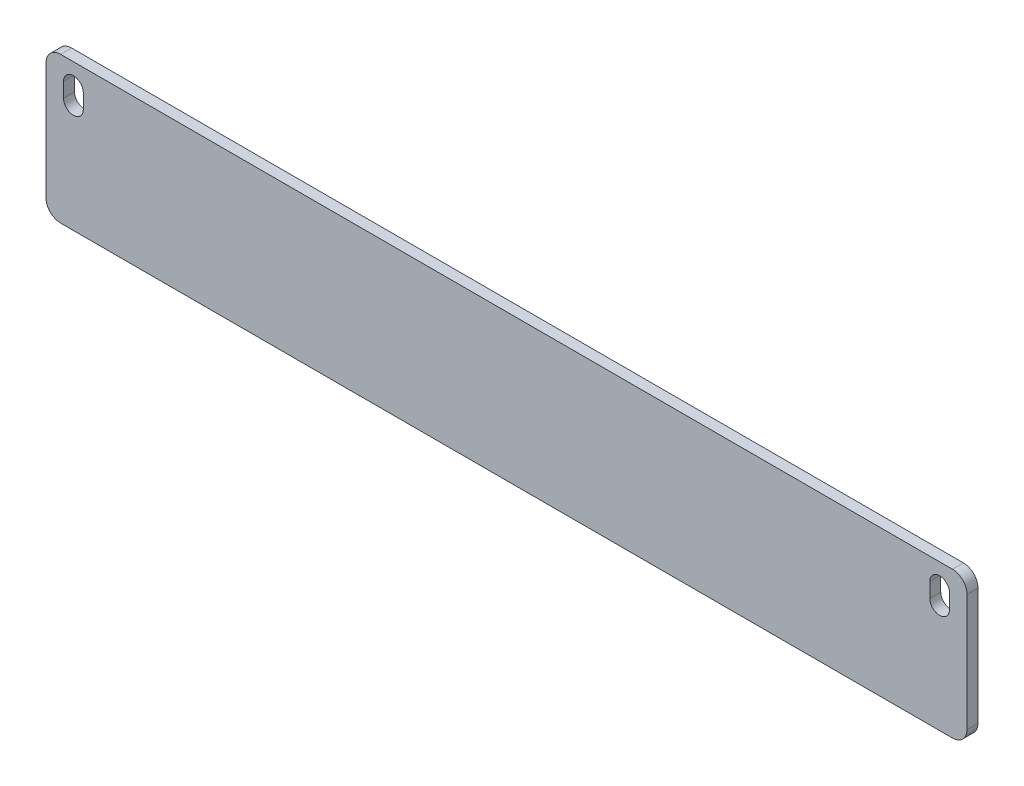
ISO-10303-21;
HEADER;
FILE_DESCRIPTION(('STEP AP214'),'2;1');
FILE_NAME('part.step','',(''),(''),'','','');
FILE_SCHEMA(('AUTOMOTIVE_DESIGN { 1 0 10303 214 1 1 1 1 }'));
ENDSEC;
DATA;
#1=APPLICATION_CONTEXT('core data for automotive mechanical design processes');
#2=APPLICATION_PROTOCOL_DEFINITION('international standard','automotive_design',2000,#1);
#3=PRODUCT_CONTEXT('',#1,'mechanical');
#4=PRODUCT('Part','Part','',(#3));
#5=PRODUCT_RELATED_PRODUCT_CATEGORY('part','',(#4));
#6=PRODUCT_DEFINITION_FORMATION('','',#4);
#7=PRODUCT_DEFINITION_CONTEXT('part definition',#1,'design');
#8=PRODUCT_DEFINITION('design','',#6,#7);
#9=PRODUCT_DEFINITION_SHAPE('','',#8);
#10=(LENGTH_UNIT() NAMED_UNIT(*) SI_UNIT(.MILLI.,.METRE.));
#11=(NAMED_UNIT(*) PLANE_ANGLE_UNIT() SI_UNIT($,.RADIAN.));
#12=(NAMED_UNIT(*) SI_UNIT($,.STERADIAN.) SOLID_ANGLE_UNIT());
#13=UNCERTAINTY_MEASURE_WITH_UNIT(LENGTH_MEASURE(1.E-05),#10,'distance_accuracy_value','');
#14=(GEOMETRIC_REPRESENTATION_CONTEXT(3) GLOBAL_UNCERTAINTY_ASSIGNED_CONTEXT((#13)) GLOBAL_UNIT_ASSIGNED_CONTEXT((#10,
#11,#12)) REPRESENTATION_CONTEXT('',''));
#15=CARTESIAN_POINT('',(0.,0.,0.));
#16=DIRECTION('',(0.,0.,1.));
#17=DIRECTION('',(1.,0.,0.));
#18=AXIS2_PLACEMENT_3D('',#15,#16,#17);
#19=CARTESIAN_POINT('',(0.,0.,3.));
#20=DIRECTION('',(0.,0.,-1.));
#21=DIRECTION('',(-1.,0.,0.));
#22=AXIS2_PLACEMENT_3D('',#19,#20,#21);
#23=PLANE('',#22);
#24=CARTESIAN_POINT('',(7.5,34.,3.));
#25=DIRECTION('',(0.,0.,1.));
#26=DIRECTION('',(1.,0.,0.));
#27=AXIS2_PLACEMENT_3D('',#24,#25,#26);
#28=CIRCLE('',#27,2.7);
#29=CARTESIAN_POINT('',(10.2,34.,3.));
#30=VERTEX_POINT('',#29);
#31=CARTESIAN_POINT('',(4.8,34.,3.));
#32=VERTEX_POINT('',#31);
#33=EDGE_CURVE('E261',#30,#32,#28,.T.);
#34=ORIENTED_EDGE('',*,*,#33,.F.);
#35=DIRECTION('',(0.,1.,0.));
#36=VECTOR('',#35,1.);
#37=CARTESIAN_POINT('',(10.2,34.,3.));
#38=LINE('',#37,#36);
#39=CARTESIAN_POINT('',(10.2,30.,3.));
#40=VERTEX_POINT('',#39);
#41=EDGE_CURVE('E269',#40,#30,#38,.T.);
#42=ORIENTED_EDGE('',*,*,#41,.F.);
#43=CARTESIAN_POINT('',(7.5,30.,3.));
#44=DIRECTION('',(0.,0.,1.));
#45=DIRECTION('',(1.,0.,0.));
#46=AXIS2_PLACEMENT_3D('',#43,#44,#45);
#47=CIRCLE('',#46,2.7);
#48=CARTESIAN_POINT('',(4.8,30.,3.));
#49=VERTEX_POINT('',#48);
#50=EDGE_CURVE('E266',#49,#40,#47,.T.);
#51=ORIENTED_EDGE('',*,*,#50,.F.);
#52=DIRECTION('',(0.,-1.,0.));
#53=VECTOR('',#52,1.);
#54=CARTESIAN_POINT('',(4.8,34.,3.));
#55=LINE('',#54,#53);
#56=EDGE_CURVE('E263',#32,#49,#55,.T.);
#57=ORIENTED_EDGE('',*,*,#56,.F.);
#58=EDGE_LOOP('',(#34,#42,#51,#57));
#59=FACE_BOUND('',#58,.T.);
#60=DIRECTION('',(0.,1.,0.));
#61=VECTOR('',#60,1.);
#62=CARTESIAN_POINT('',(252.,0.,3.));
#63=LINE('',#62,#61);
#64=CARTESIAN_POINT('',(252.,4.,3.));
#65=VERTEX_POINT('',#64);
#66=CARTESIAN_POINT('',(252.,36.,3.));
#67=VERTEX_POINT('',#66);
#68=EDGE_CURVE('E299',#65,#67,#63,.T.);
#69=ORIENTED_EDGE('',*,*,#68,.T.);
#70=CARTESIAN_POINT('',(248.,36.,3.));
#71=DIRECTION('',(0.,0.,-1.));
#72=DIRECTION('',(-1.,0.,0.));
#73=AXIS2_PLACEMENT_3D('',#70,#71,#72);
#74=CIRCLE('',#73,4.);
#75=CARTESIAN_POINT('',(248.,40.,3.));
#76=VERTEX_POINT('',#75);
#77=EDGE_CURVE('E341',#67,#76,#74,.F.);
#78=ORIENTED_EDGE('',*,*,#77,.T.);
#79=DIRECTION('',(-1.,0.,0.));
#80=VECTOR('',#79,1.);
#81=CARTESIAN_POINT('',(0.,40.,3.));
#82=LINE('',#81,#80);
#83=CARTESIAN_POINT('',(4.,40.,3.));
#84=VERTEX_POINT('',#83);
#85=EDGE_CURVE('E302',#76,#84,#82,.T.);
#86=ORIENTED_EDGE('',*,*,#85,.T.);
#87=CARTESIAN_POINT('',(4.,36.,3.));
#88=DIRECTION('',(0.,0.,-1.));
#89=DIRECTION('',(-1.,0.,0.));
#90=AXIS2_PLACEMENT_3D('',#87,#88,#89);
#91=CIRCLE('',#90,4.);
#92=CARTESIAN_POINT('',(0.,36.,3.));
#93=VERTEX_POINT('',#92);
#94=EDGE_CURVE('E335',#84,#93,#91,.F.);
#95=ORIENTED_EDGE('',*,*,#94,.T.);
#96=DIRECTION('',(0.,-1.,0.));
#97=VECTOR('',#96,1.);
#98=CARTESIAN_POINT('',(0.,0.,3.));
#99=LINE('',#98,#97);
#100=CARTESIAN_POINT('',(0.,4.,3.));
#101=VERTEX_POINT('',#100);
#102=EDGE_CURVE('E292',#93,#101,#99,.T.);
#103=ORIENTED_EDGE('',*,*,#102,.T.);
#104=CARTESIAN_POINT('',(4.,4.,3.));
#105=DIRECTION('',(0.,0.,-1.));
#106=DIRECTION('',(-1.,0.,0.));
#107=AXIS2_PLACEMENT_3D('',#104,#105,#106);
#108=CIRCLE('',#107,4.);
#109=CARTESIAN_POINT('',(4.,0.,3.));
#110=VERTEX_POINT('',#109);
#111=EDGE_CURVE('E337',#101,#110,#108,.F.);
#112=ORIENTED_EDGE('',*,*,#111,.T.);
#113=DIRECTION('',(1.,0.,0.));
#114=VECTOR('',#113,1.);
#115=CARTESIAN_POINT('',(0.,0.,3.));
#116=LINE('',#115,#114);
#117=CARTESIAN_POINT('',(248.,0.,3.));
#118=VERTEX_POINT('',#117);
#119=EDGE_CURVE('E295',#110,#118,#116,.T.);
#120=ORIENTED_EDGE('',*,*,#119,.T.);
#121=CARTESIAN_POINT('',(248.,4.,3.));
#122=DIRECTION('',(0.,0.,-1.));
#123=DIRECTION('',(-1.,0.,0.));
#124=AXIS2_PLACEMENT_3D('',#121,#122,#123);
#125=CIRCLE('',#124,4.);
#126=EDGE_CURVE('E339',#118,#65,#125,.F.);
#127=ORIENTED_EDGE('',*,*,#126,.T.);
#128=EDGE_LOOP('',(#69,#78,#86,#95,#103,#112,#120,#127));
#129=FACE_BOUND('',#128,.T.);
#130=CARTESIAN_POINT('',(244.5,34.,3.));
#131=DIRECTION('',(0.,0.,1.));
#132=DIRECTION('',(1.,0.,0.));
#133=AXIS2_PLACEMENT_3D('',#130,#131,#132);
#134=CIRCLE('',#133,2.70000000000004);
#135=CARTESIAN_POINT('',(247.2,34.,3.));
#136=VERTEX_POINT('',#135);
#137=CARTESIAN_POINT('',(241.8,34.,3.));
#138=VERTEX_POINT('',#137);
#139=EDGE_CURVE('E218',#136,#138,#134,.T.);
#140=ORIENTED_EDGE('',*,*,#139,.F.);
#141=DIRECTION('',(0.,1.,0.));
#142=VECTOR('',#141,1.);
#143=CARTESIAN_POINT('',(247.2,34.,3.));
#144=LINE('',#143,#142);
#145=CARTESIAN_POINT('',(247.2,30.,3.));
#146=VERTEX_POINT('',#145);
#147=EDGE_CURVE('E243',#146,#136,#144,.T.);
#148=ORIENTED_EDGE('',*,*,#147,.F.);
#149=CARTESIAN_POINT('',(244.5,30.,3.));
#150=DIRECTION('',(0.,0.,1.));
#151=DIRECTION('',(1.,0.,0.));
#152=AXIS2_PLACEMENT_3D('',#149,#150,#151);
#153=CIRCLE('',#152,2.69999999999998);
#154=CARTESIAN_POINT('',(241.8,30.,3.));
#155=VERTEX_POINT('',#154);
#156=EDGE_CURVE('E241',#155,#146,#153,.T.);
#157=ORIENTED_EDGE('',*,*,#156,.F.);
#158=DIRECTION('',(0.,-1.,0.));
#159=VECTOR('',#158,1.);
#160=CARTESIAN_POINT('',(241.8,34.,3.));
#161=LINE('',#160,#159);
#162=EDGE_CURVE('E228',#138,#155,#161,.T.);
#163=ORIENTED_EDGE('',*,*,#162,.F.);
#164=EDGE_LOOP('',(#140,#148,#157,#163));
#165=FACE_BOUND('',#164,.T.);
#166=ADVANCED_FACE('F38',(#59,#129,#165),#23,.F.);
#167=CARTESIAN_POINT('',(0.,0.,0.));
#168=DIRECTION('',(0.,0.,-1.));
#169=DIRECTION('',(-1.,0.,0.));
#170=AXIS2_PLACEMENT_3D('',#167,#168,#169);
#171=PLANE('',#170);
#172=CARTESIAN_POINT('',(17.,4.,0.));
#173=DIRECTION('',(0.,0.,-1.));
#174=DIRECTION('',(-1.,0.,0.));
#175=AXIS2_PLACEMENT_3D('',#172,#173,#174);
#176=CIRCLE('',#175,2.);
#177=CARTESIAN_POINT('',(15.,4.,0.));
#178=VERTEX_POINT('',#177);
#179=CARTESIAN_POINT('',(17.,6.,0.));
#180=VERTEX_POINT('',#179);
#181=EDGE_CURVE('E353',#178,#180,#176,.T.);
#182=ORIENTED_EDGE('',*,*,#181,.F.);
#183=DIRECTION('',(0.,-1.,0.));
#184=VECTOR('',#183,1.);
#185=CARTESIAN_POINT('',(15.,0.,0.));
#186=LINE('',#185,#184);
#187=CARTESIAN_POINT('',(15.,0.,0.));
#188=VERTEX_POINT('',#187);
#189=EDGE_CURVE('E363',#178,#188,#186,.T.);
#190=ORIENTED_EDGE('',*,*,#189,.T.);
#191=DIRECTION('',(1.,0.,0.));
#192=VECTOR('',#191,1.);
#193=CARTESIAN_POINT('',(0.,0.,0.));
#194=LINE('',#193,#192);
#195=CARTESIAN_POINT('',(4.,0.,0.));
#196=VERTEX_POINT('',#195);
#197=EDGE_CURVE('E309',#196,#188,#194,.T.);
#198=ORIENTED_EDGE('',*,*,#197,.F.);
#199=CARTESIAN_POINT('',(4.,4.,0.));
#200=DIRECTION('',(0.,0.,-1.));
#201=DIRECTION('',(-1.,0.,0.));
#202=AXIS2_PLACEMENT_3D('',#199,#200,#201);
#203=CIRCLE('',#202,4.);
#204=CARTESIAN_POINT('',(0.,4.,0.));
#205=VERTEX_POINT('',#204);
#206=EDGE_CURVE('E323',#196,#205,#203,.T.);
#207=ORIENTED_EDGE('',*,*,#206,.T.);
#208=DIRECTION('',(0.,-1.,0.));
#209=VECTOR('',#208,1.);
#210=CARTESIAN_POINT('',(0.,0.,0.));
#211=LINE('',#210,#209);
#212=CARTESIAN_POINT('',(0.,36.,0.));
#213=VERTEX_POINT('',#212);
#214=EDGE_CURVE('E291',#213,#205,#211,.T.);
#215=ORIENTED_EDGE('',*,*,#214,.F.);
#216=CARTESIAN_POINT('',(4.,36.,0.));
#217=DIRECTION('',(0.,0.,-1.));
#218=DIRECTION('',(-1.,0.,0.));
#219=AXIS2_PLACEMENT_3D('',#216,#217,#218);
#220=CIRCLE('',#219,4.);
#221=CARTESIAN_POINT('',(4.,40.,0.));
#222=VERTEX_POINT('',#221);
#223=EDGE_CURVE('E321',#213,#222,#220,.T.);
#224=ORIENTED_EDGE('',*,*,#223,.T.);
#225=DIRECTION('',(-1.,0.,0.));
#226=VECTOR('',#225,1.);
#227=CARTESIAN_POINT('',(0.,40.,0.));
#228=LINE('',#227,#226);
#229=CARTESIAN_POINT('',(248.,40.,0.));
#230=VERTEX_POINT('',#229);
#231=EDGE_CURVE('E296',#230,#222,#228,.T.);
#232=ORIENTED_EDGE('',*,*,#231,.F.);
#233=CARTESIAN_POINT('',(248.,36.,0.));
#234=DIRECTION('',(0.,0.,-1.));
#235=DIRECTION('',(-1.,0.,0.));
#236=AXIS2_PLACEMENT_3D('',#233,#234,#235);
#237=CIRCLE('',#236,4.);
#238=CARTESIAN_POINT('',(252.,36.,0.));
#239=VERTEX_POINT('',#238);
#240=EDGE_CURVE('E328',#230,#239,#237,.T.);
#241=ORIENTED_EDGE('',*,*,#240,.T.);
#242=DIRECTION('',(0.,1.,0.));
#243=VECTOR('',#242,1.);
#244=CARTESIAN_POINT('',(252.,0.,0.));
#245=LINE('',#244,#243);
#246=CARTESIAN_POINT('',(252.,4.,0.));
#247=VERTEX_POINT('',#246);
#248=EDGE_CURVE('E312',#247,#239,#245,.T.);
#249=ORIENTED_EDGE('',*,*,#248,.F.);
#250=CARTESIAN_POINT('',(248.,4.,0.));
#251=DIRECTION('',(0.,0.,-1.));
#252=DIRECTION('',(-1.,0.,0.));
#253=AXIS2_PLACEMENT_3D('',#250,#251,#252);
#254=CIRCLE('',#253,4.);
#255=CARTESIAN_POINT('',(248.,0.,0.));
#256=VERTEX_POINT('',#255);
#257=EDGE_CURVE('E325',#247,#256,#254,.T.);
#258=ORIENTED_EDGE('',*,*,#257,.T.);
#259=CARTESIAN_POINT('',(237.,0.,0.));
#260=VERTEX_POINT('',#259);
#261=EDGE_CURVE('E308',#260,#256,#194,.T.);
#262=ORIENTED_EDGE('',*,*,#261,.F.);
#263=DIRECTION('',(0.,-1.,0.));
#264=VECTOR('',#263,1.);
#265=CARTESIAN_POINT('',(237.,5.,0.));
#266=LINE('',#265,#264);
#267=CARTESIAN_POINT('',(237.,4.,0.));
#268=VERTEX_POINT('',#267);
#269=EDGE_CURVE('E361',#260,#268,#266,.F.);
#270=ORIENTED_EDGE('',*,*,#269,.T.);
#271=CARTESIAN_POINT('',(235.,4.,0.));
#272=DIRECTION('',(0.,0.,-1.));
#273=DIRECTION('',(-1.,0.,0.));
#274=AXIS2_PLACEMENT_3D('',#271,#272,#273);
#275=CIRCLE('',#274,2.);
#276=CARTESIAN_POINT('',(235.,6.,0.));
#277=VERTEX_POINT('',#276);
#278=EDGE_CURVE('E358',#277,#268,#275,.T.);
#279=ORIENTED_EDGE('',*,*,#278,.F.);
#280=DIRECTION('',(-1.,0.,0.));
#281=VECTOR('',#280,1.);
#282=CARTESIAN_POINT('',(0.,6.,0.));
#283=LINE('',#282,#281);
#284=EDGE_CURVE('E356',#277,#180,#283,.T.);
#285=ORIENTED_EDGE('',*,*,#284,.T.);
#286=EDGE_LOOP('',(#182,#190,#198,#207,#215,#224,#232,#241,#249,#258,#262,#270,#279,#285));
#287=FACE_BOUND('',#286,.T.);
#288=DIRECTION('',(0.,1.,0.));
#289=VECTOR('',#288,1.);
#290=CARTESIAN_POINT('',(10.2,34.,0.));
#291=LINE('',#290,#289);
#292=CARTESIAN_POINT('',(10.2,30.,0.));
#293=VERTEX_POINT('',#292);
#294=CARTESIAN_POINT('',(10.2,34.,0.));
#295=VERTEX_POINT('',#294);
#296=EDGE_CURVE('E264',#293,#295,#291,.T.);
#297=ORIENTED_EDGE('',*,*,#296,.T.);
#298=CARTESIAN_POINT('',(7.5,34.,0.));
#299=DIRECTION('',(0.,0.,1.));
#300=DIRECTION('',(1.,0.,0.));
#301=AXIS2_PLACEMENT_3D('',#298,#299,#300);
#302=CIRCLE('',#301,2.7);
#303=CARTESIAN_POINT('',(4.8,34.,0.));
#304=VERTEX_POINT('',#303);
#305=EDGE_CURVE('E236',#295,#304,#302,.T.);
#306=ORIENTED_EDGE('',*,*,#305,.T.);
#307=DIRECTION('',(0.,-1.,0.));
#308=VECTOR('',#307,1.);
#309=CARTESIAN_POINT('',(4.8,34.,0.));
#310=LINE('',#309,#308);
#311=CARTESIAN_POINT('',(4.8,30.,0.));
#312=VERTEX_POINT('',#311);
#313=EDGE_CURVE('E274',#304,#312,#310,.T.);
#314=ORIENTED_EDGE('',*,*,#313,.T.);
#315=CARTESIAN_POINT('',(7.5,30.,0.));
#316=DIRECTION('',(0.,0.,1.));
#317=DIRECTION('',(1.,0.,0.));
#318=AXIS2_PLACEMENT_3D('',#315,#316,#317);
#319=CIRCLE('',#318,2.7);
#320=EDGE_CURVE('E277',#312,#293,#319,.T.);
#321=ORIENTED_EDGE('',*,*,#320,.T.);
#322=EDGE_LOOP('',(#297,#306,#314,#321));
#323=FACE_BOUND('',#322,.T.);
#324=DIRECTION('',(0.,1.,0.));
#325=VECTOR('',#324,1.);
#326=CARTESIAN_POINT('',(247.2,34.,0.));
#327=LINE('',#326,#325);
#328=CARTESIAN_POINT('',(247.2,30.,0.));
#329=VERTEX_POINT('',#328);
#330=CARTESIAN_POINT('',(247.2,34.,0.));
#331=VERTEX_POINT('',#330);
#332=EDGE_CURVE('E229',#329,#331,#327,.T.);
#333=ORIENTED_EDGE('',*,*,#332,.T.);
#334=CARTESIAN_POINT('',(244.5,34.,0.));
#335=DIRECTION('',(0.,0.,1.));
#336=DIRECTION('',(1.,0.,0.));
#337=AXIS2_PLACEMENT_3D('',#334,#335,#336);
#338=CIRCLE('',#337,2.70000000000004);
#339=CARTESIAN_POINT('',(241.8,34.,0.));
#340=VERTEX_POINT('',#339);
#341=EDGE_CURVE('E248',#331,#340,#338,.T.);
#342=ORIENTED_EDGE('',*,*,#341,.T.);
#343=DIRECTION('',(0.,-1.,0.));
#344=VECTOR('',#343,1.);
#345=CARTESIAN_POINT('',(241.8,34.,0.));
#346=LINE('',#345,#344);
#347=CARTESIAN_POINT('',(241.8,30.,0.));
#348=VERTEX_POINT('',#347);
#349=EDGE_CURVE('E235',#340,#348,#346,.T.);
#350=ORIENTED_EDGE('',*,*,#349,.T.);
#351=CARTESIAN_POINT('',(244.5,30.,0.));
#352=DIRECTION('',(0.,0.,1.));
#353=DIRECTION('',(1.,0.,0.));
#354=AXIS2_PLACEMENT_3D('',#351,#352,#353);
#355=CIRCLE('',#354,2.69999999999998);
#356=EDGE_CURVE('E252',#348,#329,#355,.T.);
#357=ORIENTED_EDGE('',*,*,#356,.T.);
#358=EDGE_LOOP('',(#333,#342,#350,#357));
#359=FACE_BOUND('',#358,.T.);
#360=ADVANCED_FACE('F457',(#287,#323,#359),#171,.T.);
#361=CARTESIAN_POINT('',(0.,0.,3.));
#362=DIRECTION('',(1.,0.,0.));
#363=DIRECTION('',(0.,0.,-1.));
#364=AXIS2_PLACEMENT_3D('',#361,#362,#363);
#365=PLANE('',#364);
#366=ORIENTED_EDGE('',*,*,#214,.T.);
#367=DIRECTION('',(0.,0.,-1.));
#368=VECTOR('',#367,1.);
#369=CARTESIAN_POINT('',(0.,4.,3.));
#370=LINE('',#369,#368);
#371=EDGE_CURVE('E351',#205,#101,#370,.F.);
#372=ORIENTED_EDGE('',*,*,#371,.T.);
#373=ORIENTED_EDGE('',*,*,#102,.F.);
#374=DIRECTION('',(0.,0.,-1.));
#375=VECTOR('',#374,1.);
#376=CARTESIAN_POINT('',(0.,36.,3.));
#377=LINE('',#376,#375);
#378=EDGE_CURVE('E348',#93,#213,#377,.T.);
#379=ORIENTED_EDGE('',*,*,#378,.T.);
#380=EDGE_LOOP('',(#366,#372,#373,#379));
#381=FACE_BOUND('',#380,.T.);
#382=ADVANCED_FACE('F490',(#381),#365,.F.);
#383=CARTESIAN_POINT('',(0.,0.,3.));
#384=DIRECTION('',(0.,1.,0.));
#385=DIRECTION('',(0.,0.,1.));
#386=AXIS2_PLACEMENT_3D('',#383,#384,#385);
#387=PLANE('',#386);
#388=DIRECTION('',(1.,0.,0.));
#389=VECTOR('',#388,1.);
#390=CARTESIAN_POINT('',(16.,0.,-8.));
#391=LINE('',#390,#389);
#392=CARTESIAN_POINT('',(17.,0.,-8.));
#393=VERTEX_POINT('',#392);
#394=CARTESIAN_POINT('',(235.,0.,-8.));
#395=VERTEX_POINT('',#394);
#396=EDGE_CURVE('E435',#393,#395,#391,.T.);
#397=ORIENTED_EDGE('',*,*,#396,.T.);
#398=CARTESIAN_POINT('',(235.,0.,-7.));
#399=DIRECTION('',(0.,1.,0.));
#400=DIRECTION('',(0.,0.,1.));
#401=AXIS2_PLACEMENT_3D('',#398,#399,#400);
#402=CIRCLE('',#401,1.);
#403=CARTESIAN_POINT('',(236.,0.,-7.));
#404=VERTEX_POINT('',#403);
#405=EDGE_CURVE('E393',#395,#404,#402,.F.);
#406=ORIENTED_EDGE('',*,*,#405,.T.);
#407=DIRECTION('',(0.,0.,1.));
#408=VECTOR('',#407,1.);
#409=CARTESIAN_POINT('',(236.,0.,-8.));
#410=LINE('',#409,#408);
#411=CARTESIAN_POINT('',(236.,0.,-1.));
#412=VERTEX_POINT('',#411);
#413=EDGE_CURVE('E250',#404,#412,#410,.T.);
#414=ORIENTED_EDGE('',*,*,#413,.T.);
#415=CARTESIAN_POINT('',(237.,0.,-1.));
#416=DIRECTION('',(0.,1.,0.));
#417=DIRECTION('',(0.,0.,1.));
#418=AXIS2_PLACEMENT_3D('',#415,#416,#417);
#419=CIRCLE('',#418,1.);
#420=EDGE_CURVE('E11',#412,#260,#419,.T.);
#421=ORIENTED_EDGE('',*,*,#420,.T.);
#422=ORIENTED_EDGE('',*,*,#261,.T.);
#423=DIRECTION('',(0.,0.,-1.));
#424=VECTOR('',#423,1.);
#425=CARTESIAN_POINT('',(248.,0.,3.));
#426=LINE('',#425,#424);
#427=EDGE_CURVE('E346',#256,#118,#426,.F.);
#428=ORIENTED_EDGE('',*,*,#427,.T.);
#429=ORIENTED_EDGE('',*,*,#119,.F.);
#430=DIRECTION('',(0.,0.,-1.));
#431=VECTOR('',#430,1.);
#432=CARTESIAN_POINT('',(4.,0.,3.));
#433=LINE('',#432,#431);
#434=EDGE_CURVE('E343',#110,#196,#433,.T.);
#435=ORIENTED_EDGE('',*,*,#434,.T.);
#436=ORIENTED_EDGE('',*,*,#197,.T.);
#437=CARTESIAN_POINT('',(15.,0.,-1.));
#438=DIRECTION('',(0.,1.,0.));
#439=DIRECTION('',(0.,0.,1.));
#440=AXIS2_PLACEMENT_3D('',#437,#438,#439);
#441=CIRCLE('',#440,1.);
#442=CARTESIAN_POINT('',(16.,0.,-1.));
#443=VERTEX_POINT('',#442);
#444=EDGE_CURVE('E47',#188,#443,#441,.T.);
#445=ORIENTED_EDGE('',*,*,#444,.T.);
#446=DIRECTION('',(0.,0.,-1.));
#447=VECTOR('',#446,1.);
#448=CARTESIAN_POINT('',(16.,0.,0.));
#449=LINE('',#448,#447);
#450=CARTESIAN_POINT('',(16.,0.,-7.));
#451=VERTEX_POINT('',#450);
#452=EDGE_CURVE('E430',#443,#451,#449,.T.);
#453=ORIENTED_EDGE('',*,*,#452,.T.);
#454=CARTESIAN_POINT('',(17.,0.,-7.));
#455=DIRECTION('',(0.,1.,0.));
#456=DIRECTION('',(0.,0.,1.));
#457=AXIS2_PLACEMENT_3D('',#454,#455,#456);
#458=CIRCLE('',#457,1.);
#459=EDGE_CURVE('E391',#451,#393,#458,.F.);
#460=ORIENTED_EDGE('',*,*,#459,.T.);
#461=EDGE_LOOP('',(#397,#406,#414,#421,#422,#428,#429,#435,#436,#445,#453,#460));
#462=FACE_BOUND('',#461,.T.);
#463=ADVANCED_FACE('F445',(#462),#387,.F.);
#464=CARTESIAN_POINT('',(252.,0.,3.));
#465=DIRECTION('',(-1.,0.,0.));
#466=DIRECTION('',(0.,0.,1.));
#467=AXIS2_PLACEMENT_3D('',#464,#465,#466);
#468=PLANE('',#467);
#469=ORIENTED_EDGE('',*,*,#248,.T.);
#470=DIRECTION('',(0.,0.,-1.));
#471=VECTOR('',#470,1.);
#472=CARTESIAN_POINT('',(252.,36.,3.));
#473=LINE('',#472,#471);
#474=EDGE_CURVE('E333',#239,#67,#473,.F.);
#475=ORIENTED_EDGE('',*,*,#474,.T.);
#476=ORIENTED_EDGE('',*,*,#68,.F.);
#477=DIRECTION('',(0.,0.,-1.));
#478=VECTOR('',#477,1.);
#479=CARTESIAN_POINT('',(252.,4.,3.));
#480=LINE('',#479,#478);
#481=EDGE_CURVE('E330',#65,#247,#480,.T.);
#482=ORIENTED_EDGE('',*,*,#481,.T.);
#483=EDGE_LOOP('',(#469,#475,#476,#482));
#484=FACE_BOUND('',#483,.T.);
#485=ADVANCED_FACE('F472',(#484),#468,.F.);
#486=CARTESIAN_POINT('',(0.,40.,3.));
#487=DIRECTION('',(0.,-1.,0.));
#488=DIRECTION('',(0.,0.,-1.));
#489=AXIS2_PLACEMENT_3D('',#486,#487,#488);
#490=PLANE('',#489);
#491=ORIENTED_EDGE('',*,*,#85,.F.);
#492=DIRECTION('',(0.,0.,-1.));
#493=VECTOR('',#492,1.);
#494=CARTESIAN_POINT('',(248.,40.,3.));
#495=LINE('',#494,#493);
#496=EDGE_CURVE('E318',#76,#230,#495,.T.);
#497=ORIENTED_EDGE('',*,*,#496,.T.);
#498=ORIENTED_EDGE('',*,*,#231,.T.);
#499=DIRECTION('',(0.,0.,-1.));
#500=VECTOR('',#499,1.);
#501=CARTESIAN_POINT('',(4.,40.,3.));
#502=LINE('',#501,#500);
#503=EDGE_CURVE('E305',#222,#84,#502,.F.);
#504=ORIENTED_EDGE('',*,*,#503,.T.);
#505=EDGE_LOOP('',(#491,#497,#498,#504));
#506=FACE_BOUND('',#505,.T.);
#507=ADVANCED_FACE('F481',(#506),#490,.F.);
#508=CARTESIAN_POINT('',(7.5,34.,3.));
#509=DIRECTION('',(0.,0.,-1.));
#510=DIRECTION('',(-1.,0.,0.));
#511=AXIS2_PLACEMENT_3D('',#508,#509,#510);
#512=CYLINDRICAL_SURFACE('',#511,2.7);
#513=ORIENTED_EDGE('',*,*,#305,.F.);
#514=DIRECTION('',(0.,0.,-1.));
#515=VECTOR('',#514,1.);
#516=CARTESIAN_POINT('',(10.2,34.,3.));
#517=LINE('',#516,#515);
#518=EDGE_CURVE('E271',#30,#295,#517,.T.);
#519=ORIENTED_EDGE('',*,*,#518,.F.);
#520=ORIENTED_EDGE('',*,*,#33,.T.);
#521=DIRECTION('',(0.,0.,-1.));
#522=VECTOR('',#521,1.);
#523=CARTESIAN_POINT('',(4.8,34.,3.));
#524=LINE('',#523,#522);
#525=EDGE_CURVE('E288',#32,#304,#524,.T.);
#526=ORIENTED_EDGE('',*,*,#525,.T.);
#527=EDGE_LOOP('',(#513,#519,#520,#526));
#528=FACE_BOUND('',#527,.T.);
#529=ADVANCED_FACE('F553',(#528),#512,.F.);
#530=CARTESIAN_POINT('',(4.8,34.,3.));
#531=DIRECTION('',(1.,0.,0.));
#532=DIRECTION('',(0.,1.,0.));
#533=AXIS2_PLACEMENT_3D('',#530,#531,#532);
#534=PLANE('',#533);
#535=ORIENTED_EDGE('',*,*,#313,.F.);
#536=ORIENTED_EDGE('',*,*,#525,.F.);
#537=ORIENTED_EDGE('',*,*,#56,.T.);
#538=DIRECTION('',(0.,0.,-1.));
#539=VECTOR('',#538,1.);
#540=CARTESIAN_POINT('',(4.8,30.,3.));
#541=LINE('',#540,#539);
#542=EDGE_CURVE('E286',#49,#312,#541,.T.);
#543=ORIENTED_EDGE('',*,*,#542,.T.);
#544=EDGE_LOOP('',(#535,#536,#537,#543));
#545=FACE_BOUND('',#544,.T.);
#546=ADVANCED_FACE('F745',(#545),#534,.T.);
#547=CARTESIAN_POINT('',(7.5,30.,3.));
#548=DIRECTION('',(0.,0.,-1.));
#549=DIRECTION('',(-1.,0.,0.));
#550=AXIS2_PLACEMENT_3D('',#547,#548,#549);
#551=CYLINDRICAL_SURFACE('',#550,2.7);
#552=ORIENTED_EDGE('',*,*,#320,.F.);
#553=ORIENTED_EDGE('',*,*,#542,.F.);
#554=ORIENTED_EDGE('',*,*,#50,.T.);
#555=DIRECTION('',(0.,0.,-1.));
#556=VECTOR('',#555,1.);
#557=CARTESIAN_POINT('',(10.2,30.,3.));
#558=LINE('',#557,#556);
#559=EDGE_CURVE('E284',#40,#293,#558,.T.);
#560=ORIENTED_EDGE('',*,*,#559,.T.);
#561=EDGE_LOOP('',(#552,#553,#554,#560));
#562=FACE_BOUND('',#561,.T.);
#563=ADVANCED_FACE('F736',(#562),#551,.F.);
#564=CARTESIAN_POINT('',(10.2,34.,3.));
#565=DIRECTION('',(-1.,0.,0.));
#566=DIRECTION('',(0.,0.,1.));
#567=AXIS2_PLACEMENT_3D('',#564,#565,#566);
#568=PLANE('',#567);
#569=ORIENTED_EDGE('',*,*,#296,.F.);
#570=ORIENTED_EDGE('',*,*,#559,.F.);
#571=ORIENTED_EDGE('',*,*,#41,.T.);
#572=ORIENTED_EDGE('',*,*,#518,.T.);
#573=EDGE_LOOP('',(#569,#570,#571,#572));
#574=FACE_BOUND('',#573,.T.);
#575=ADVANCED_FACE('F728',(#574),#568,.T.);
#576=CARTESIAN_POINT('',(244.5,34.,3.));
#577=DIRECTION('',(0.,0.,-1.));
#578=DIRECTION('',(-1.,0.,0.));
#579=AXIS2_PLACEMENT_3D('',#576,#577,#578);
#580=CYLINDRICAL_SURFACE('',#579,2.70000000000004);
#581=ORIENTED_EDGE('',*,*,#341,.F.);
#582=DIRECTION('',(0.,0.,-1.));
#583=VECTOR('',#582,1.);
#584=CARTESIAN_POINT('',(247.2,34.,3.));
#585=LINE('',#584,#583);
#586=EDGE_CURVE('E224',#136,#331,#585,.T.);
#587=ORIENTED_EDGE('',*,*,#586,.F.);
#588=ORIENTED_EDGE('',*,*,#139,.T.);
#589=DIRECTION('',(0.,0.,-1.));
#590=VECTOR('',#589,1.);
#591=CARTESIAN_POINT('',(241.8,34.,3.));
#592=LINE('',#591,#590);
#593=EDGE_CURVE('E221',#138,#340,#592,.T.);
#594=ORIENTED_EDGE('',*,*,#593,.T.);
#595=EDGE_LOOP('',(#581,#587,#588,#594));
#596=FACE_BOUND('',#595,.T.);
#597=ADVANCED_FACE('F220',(#596),#580,.F.);
#598=CARTESIAN_POINT('',(241.8,34.,3.));
#599=DIRECTION('',(1.,0.,0.));
#600=DIRECTION('',(0.,1.,0.));
#601=AXIS2_PLACEMENT_3D('',#598,#599,#600);
#602=PLANE('',#601);
#603=ORIENTED_EDGE('',*,*,#349,.F.);
#604=ORIENTED_EDGE('',*,*,#593,.F.);
#605=ORIENTED_EDGE('',*,*,#162,.T.);
#606=DIRECTION('',(0.,0.,-1.));
#607=VECTOR('',#606,1.);
#608=CARTESIAN_POINT('',(241.8,30.,3.));
#609=LINE('',#608,#607);
#610=EDGE_CURVE('E237',#155,#348,#609,.T.);
#611=ORIENTED_EDGE('',*,*,#610,.T.);
#612=EDGE_LOOP('',(#603,#604,#605,#611));
#613=FACE_BOUND('',#612,.T.);
#614=ADVANCED_FACE('F232',(#613),#602,.T.);
#615=CARTESIAN_POINT('',(244.5,30.,3.));
#616=DIRECTION('',(0.,0.,-1.));
#617=DIRECTION('',(-1.,0.,0.));
#618=AXIS2_PLACEMENT_3D('',#615,#616,#617);
#619=CYLINDRICAL_SURFACE('',#618,2.69999999999998);
#620=ORIENTED_EDGE('',*,*,#356,.F.);
#621=ORIENTED_EDGE('',*,*,#610,.F.);
#622=ORIENTED_EDGE('',*,*,#156,.T.);
#623=DIRECTION('',(0.,0.,-1.));
#624=VECTOR('',#623,1.);
#625=CARTESIAN_POINT('',(247.2,30.,3.));
#626=LINE('',#625,#624);
#627=EDGE_CURVE('E258',#146,#329,#626,.T.);
#628=ORIENTED_EDGE('',*,*,#627,.T.);
#629=EDGE_LOOP('',(#620,#621,#622,#628));
#630=FACE_BOUND('',#629,.T.);
#631=ADVANCED_FACE('F704',(#630),#619,.F.);
#632=CARTESIAN_POINT('',(247.2,34.,3.));
#633=DIRECTION('',(-1.,0.,0.));
#634=DIRECTION('',(0.,-1.,0.));
#635=AXIS2_PLACEMENT_3D('',#632,#633,#634);
#636=PLANE('',#635);
#637=ORIENTED_EDGE('',*,*,#332,.F.);
#638=ORIENTED_EDGE('',*,*,#627,.F.);
#639=ORIENTED_EDGE('',*,*,#147,.T.);
#640=ORIENTED_EDGE('',*,*,#586,.T.);
#641=EDGE_LOOP('',(#637,#638,#639,#640));
#642=FACE_BOUND('',#641,.T.);
#643=ADVANCED_FACE('F696',(#642),#636,.T.);
#644=CARTESIAN_POINT('',(236.,5.,-8.));
#645=DIRECTION('',(1.,0.,0.));
#646=DIRECTION('',(0.,0.,-1.));
#647=AXIS2_PLACEMENT_3D('',#644,#645,#646);
#648=PLANE('',#647);
#649=DIRECTION('',(0.,0.,1.));
#650=VECTOR('',#649,1.);
#651=CARTESIAN_POINT('',(236.,4.,0.));
#652=LINE('',#651,#650);
#653=CARTESIAN_POINT('',(236.,4.,-7.));
#654=VERTEX_POINT('',#653);
#655=CARTESIAN_POINT('',(236.,4.,-1.));
#656=VERTEX_POINT('',#655);
#657=EDGE_CURVE('E374',#654,#656,#652,.T.);
#658=ORIENTED_EDGE('',*,*,#657,.T.);
#659=DIRECTION('',(0.,-1.,0.));
#660=VECTOR('',#659,1.);
#661=CARTESIAN_POINT('',(236.,0.,-1.));
#662=LINE('',#661,#660);
#663=EDGE_CURVE('E376',#656,#412,#662,.T.);
#664=ORIENTED_EDGE('',*,*,#663,.T.);
#665=ORIENTED_EDGE('',*,*,#413,.F.);
#666=DIRECTION('',(0.,-1.,0.));
#667=VECTOR('',#666,1.);
#668=CARTESIAN_POINT('',(236.,5.,-7.));
#669=LINE('',#668,#667);
#670=EDGE_CURVE('E372',#404,#654,#669,.F.);
#671=ORIENTED_EDGE('',*,*,#670,.T.);
#672=EDGE_LOOP('',(#658,#664,#665,#671));
#673=FACE_BOUND('',#672,.T.);
#674=ADVANCED_FACE('F528',(#673),#648,.T.);
#675=CARTESIAN_POINT('',(16.,5.,-8.));
#676=DIRECTION('',(0.,0.,-1.));
#677=DIRECTION('',(-1.,0.,0.));
#678=AXIS2_PLACEMENT_3D('',#675,#676,#677);
#679=PLANE('',#678);
#680=DIRECTION('',(1.,0.,0.));
#681=VECTOR('',#680,1.);
#682=CARTESIAN_POINT('',(236.,4.,-8.));
#683=LINE('',#682,#681);
#684=CARTESIAN_POINT('',(17.,4.,-8.));
#685=VERTEX_POINT('',#684);
#686=CARTESIAN_POINT('',(235.,4.,-8.));
#687=VERTEX_POINT('',#686);
#688=EDGE_CURVE('E55',#685,#687,#683,.T.);
#689=ORIENTED_EDGE('',*,*,#688,.T.);
#690=DIRECTION('',(0.,-1.,0.));
#691=VECTOR('',#690,1.);
#692=CARTESIAN_POINT('',(235.,5.,-8.));
#693=LINE('',#692,#691);
#694=EDGE_CURVE('E389',#687,#395,#693,.T.);
#695=ORIENTED_EDGE('',*,*,#694,.T.);
#696=ORIENTED_EDGE('',*,*,#396,.F.);
#697=DIRECTION('',(0.,-1.,0.));
#698=VECTOR('',#697,1.);
#699=CARTESIAN_POINT('',(17.,5.,-8.));
#700=LINE('',#699,#698);
#701=EDGE_CURVE('E60',#393,#685,#700,.F.);
#702=ORIENTED_EDGE('',*,*,#701,.T.);
#703=EDGE_LOOP('',(#689,#695,#696,#702));
#704=FACE_BOUND('',#703,.T.);
#705=ADVANCED_FACE('F526',(#704),#679,.T.);
#706=CARTESIAN_POINT('',(16.,5.,0.));
#707=DIRECTION('',(-1.,0.,0.));
#708=DIRECTION('',(0.,0.,1.));
#709=AXIS2_PLACEMENT_3D('',#706,#707,#708);
#710=PLANE('',#709);
#711=ORIENTED_EDGE('',*,*,#452,.F.);
#712=DIRECTION('',(0.,-1.,0.));
#713=VECTOR('',#712,1.);
#714=CARTESIAN_POINT('',(16.,5.,-1.));
#715=LINE('',#714,#713);
#716=CARTESIAN_POINT('',(16.,4.,-1.));
#717=VERTEX_POINT('',#716);
#718=EDGE_CURVE('E370',#443,#717,#715,.F.);
#719=ORIENTED_EDGE('',*,*,#718,.T.);
#720=DIRECTION('',(0.,0.,-1.));
#721=VECTOR('',#720,1.);
#722=CARTESIAN_POINT('',(16.,4.,-8.));
#723=LINE('',#722,#721);
#724=CARTESIAN_POINT('',(16.,4.,-7.));
#725=VERTEX_POINT('',#724);
#726=EDGE_CURVE('E368',#717,#725,#723,.T.);
#727=ORIENTED_EDGE('',*,*,#726,.T.);
#728=DIRECTION('',(0.,-1.,0.));
#729=VECTOR('',#728,1.);
#730=CARTESIAN_POINT('',(16.,5.,-7.));
#731=LINE('',#730,#729);
#732=EDGE_CURVE('E366',#725,#451,#731,.T.);
#733=ORIENTED_EDGE('',*,*,#732,.T.);
#734=EDGE_LOOP('',(#711,#719,#727,#733));
#735=FACE_BOUND('',#734,.T.);
#736=ADVANCED_FACE('F499',(#735),#710,.T.);
#737=CARTESIAN_POINT('',(0.,5.,0.));
#738=DIRECTION('',(0.,-1.,0.));
#739=DIRECTION('',(0.,0.,-1.));
#740=AXIS2_PLACEMENT_3D('',#737,#738,#739);
#741=PLANE('',#740);
#742=DIRECTION('',(1.,0.,0.));
#743=VECTOR('',#742,1.);
#744=CARTESIAN_POINT('',(16.,5.,-7.));
#745=LINE('',#744,#743);
#746=CARTESIAN_POINT('',(235.,5.,-7.));
#747=VERTEX_POINT('',#746);
#748=CARTESIAN_POINT('',(17.,5.,-7.));
#749=VERTEX_POINT('',#748);
#750=EDGE_CURVE('E382',#747,#749,#745,.F.);
#751=ORIENTED_EDGE('',*,*,#750,.T.);
#752=DIRECTION('',(0.,0.,-1.));
#753=VECTOR('',#752,1.);
#754=CARTESIAN_POINT('',(17.,5.,0.));
#755=LINE('',#754,#753);
#756=CARTESIAN_POINT('',(17.,5.,-1.));
#757=VERTEX_POINT('',#756);
#758=EDGE_CURVE('E384',#749,#757,#755,.F.);
#759=ORIENTED_EDGE('',*,*,#758,.T.);
#760=DIRECTION('',(-1.,0.,0.));
#761=VECTOR('',#760,1.);
#762=CARTESIAN_POINT('',(0.,5.,-1.));
#763=LINE('',#762,#761);
#764=CARTESIAN_POINT('',(235.,5.,-1.));
#765=VERTEX_POINT('',#764);
#766=EDGE_CURVE('E378',#757,#765,#763,.F.);
#767=ORIENTED_EDGE('',*,*,#766,.T.);
#768=DIRECTION('',(0.,0.,1.));
#769=VECTOR('',#768,1.);
#770=CARTESIAN_POINT('',(235.,5.,-8.));
#771=LINE('',#770,#769);
#772=EDGE_CURVE('E380',#765,#747,#771,.F.);
#773=ORIENTED_EDGE('',*,*,#772,.T.);
#774=EDGE_LOOP('',(#751,#759,#767,#773));
#775=FACE_BOUND('',#774,.T.);
#776=ADVANCED_FACE('F517',(#775),#741,.F.);
#777=CARTESIAN_POINT('',(248.,36.,3.));
#778=DIRECTION('',(0.,0.,-1.));
#779=DIRECTION('',(-1.,0.,0.));
#780=AXIS2_PLACEMENT_3D('',#777,#778,#779);
#781=CYLINDRICAL_SURFACE('',#780,4.);
#782=ORIENTED_EDGE('',*,*,#77,.F.);
#783=ORIENTED_EDGE('',*,*,#474,.F.);
#784=ORIENTED_EDGE('',*,*,#240,.F.);
#785=ORIENTED_EDGE('',*,*,#496,.F.);
#786=EDGE_LOOP('',(#782,#783,#784,#785));
#787=FACE_BOUND('',#786,.T.);
#788=ADVANCED_FACE('F478',(#787),#781,.T.);
#789=CARTESIAN_POINT('',(248.,4.,3.));
#790=DIRECTION('',(0.,0.,-1.));
#791=DIRECTION('',(-1.,0.,0.));
#792=AXIS2_PLACEMENT_3D('',#789,#790,#791);
#793=CYLINDRICAL_SURFACE('',#792,4.);
#794=ORIENTED_EDGE('',*,*,#126,.F.);
#795=ORIENTED_EDGE('',*,*,#427,.F.);
#796=ORIENTED_EDGE('',*,*,#257,.F.);
#797=ORIENTED_EDGE('',*,*,#481,.F.);
#798=EDGE_LOOP('',(#794,#795,#796,#797));
#799=FACE_BOUND('',#798,.T.);
#800=ADVANCED_FACE('F470',(#799),#793,.T.);
#801=CARTESIAN_POINT('',(4.,4.,3.));
#802=DIRECTION('',(0.,0.,-1.));
#803=DIRECTION('',(-1.,0.,0.));
#804=AXIS2_PLACEMENT_3D('',#801,#802,#803);
#805=CYLINDRICAL_SURFACE('',#804,4.);
#806=ORIENTED_EDGE('',*,*,#111,.F.);
#807=ORIENTED_EDGE('',*,*,#371,.F.);
#808=ORIENTED_EDGE('',*,*,#206,.F.);
#809=ORIENTED_EDGE('',*,*,#434,.F.);
#810=EDGE_LOOP('',(#806,#807,#808,#809));
#811=FACE_BOUND('',#810,.T.);
#812=ADVANCED_FACE('F494',(#811),#805,.T.);
#813=CARTESIAN_POINT('',(4.,36.,3.));
#814=DIRECTION('',(0.,0.,-1.));
#815=DIRECTION('',(-1.,0.,0.));
#816=AXIS2_PLACEMENT_3D('',#813,#814,#815);
#817=CYLINDRICAL_SURFACE('',#816,4.);
#818=ORIENTED_EDGE('',*,*,#94,.F.);
#819=ORIENTED_EDGE('',*,*,#503,.F.);
#820=ORIENTED_EDGE('',*,*,#223,.F.);
#821=ORIENTED_EDGE('',*,*,#378,.F.);
#822=EDGE_LOOP('',(#818,#819,#820,#821));
#823=FACE_BOUND('',#822,.T.);
#824=ADVANCED_FACE('F487',(#823),#817,.T.);
#825=CARTESIAN_POINT('',(235.,5.,-7.));
#826=DIRECTION('',(0.,-1.,0.));
#827=DIRECTION('',(0.,0.,-1.));
#828=AXIS2_PLACEMENT_3D('',#825,#826,#827);
#829=CYLINDRICAL_SURFACE('',#828,1.);
#830=CARTESIAN_POINT('',(235.,4.,-7.));
#831=DIRECTION('',(0.,1.,0.));
#832=DIRECTION('',(0.,0.,1.));
#833=AXIS2_PLACEMENT_3D('',#830,#831,#832);
#834=CIRCLE('',#833,1.);
#835=EDGE_CURVE('E42',#654,#687,#834,.T.);
#836=ORIENTED_EDGE('',*,*,#835,.F.);
#837=ORIENTED_EDGE('',*,*,#670,.F.);
#838=ORIENTED_EDGE('',*,*,#405,.F.);
#839=ORIENTED_EDGE('',*,*,#694,.F.);
#840=EDGE_LOOP('',(#836,#837,#838,#839));
#841=FACE_BOUND('',#840,.T.);
#842=ADVANCED_FACE('F40',(#841),#829,.T.);
#843=CARTESIAN_POINT('',(235.,4.,-7.));
#844=DIRECTION('',(0.,0.,-1.));
#845=DIRECTION('',(-1.,0.,0.));
#846=AXIS2_PLACEMENT_3D('',#843,#844,#845);
#847=SPHERICAL_SURFACE('',#846,1.);
#848=CARTESIAN_POINT('',(235.,4.,-7.));
#849=DIRECTION('',(0.,0.,-1.));
#850=DIRECTION('',(-1.,0.,0.));
#851=AXIS2_PLACEMENT_3D('',#848,#849,#850);
#852=CIRCLE('',#851,1.);
#853=EDGE_CURVE('E422',#654,#747,#852,.F.);
#854=ORIENTED_EDGE('',*,*,#853,.F.);
#855=ORIENTED_EDGE('',*,*,#835,.T.);
#856=CARTESIAN_POINT('',(235.,4.,-7.));
#857=DIRECTION('',(1.,0.,0.));
#858=DIRECTION('',(0.,0.,-1.));
#859=AXIS2_PLACEMENT_3D('',#856,#857,#858);
#860=CIRCLE('',#859,1.);
#861=EDGE_CURVE('E424',#747,#687,#860,.F.);
#862=ORIENTED_EDGE('',*,*,#861,.F.);
#863=EDGE_LOOP('',(#854,#855,#862));
#864=FACE_BOUND('',#863,.T.);
#865=ADVANCED_FACE('F635',(#864),#847,.T.);
#866=CARTESIAN_POINT('',(17.,5.,-7.));
#867=DIRECTION('',(0.,-1.,0.));
#868=DIRECTION('',(0.,0.,-1.));
#869=AXIS2_PLACEMENT_3D('',#866,#867,#868);
#870=CYLINDRICAL_SURFACE('',#869,1.);
#871=ORIENTED_EDGE('',*,*,#459,.F.);
#872=ORIENTED_EDGE('',*,*,#732,.F.);
#873=CARTESIAN_POINT('',(17.,4.,-7.));
#874=DIRECTION('',(0.,1.,0.));
#875=DIRECTION('',(0.,0.,1.));
#876=AXIS2_PLACEMENT_3D('',#873,#874,#875);
#877=CIRCLE('',#876,1.);
#878=EDGE_CURVE('E419',#685,#725,#877,.T.);
#879=ORIENTED_EDGE('',*,*,#878,.F.);
#880=ORIENTED_EDGE('',*,*,#701,.F.);
#881=EDGE_LOOP('',(#871,#872,#879,#880));
#882=FACE_BOUND('',#881,.T.);
#883=ADVANCED_FACE('F525',(#882),#870,.T.);
#884=CARTESIAN_POINT('',(16.,4.,-7.));
#885=DIRECTION('',(-1.,0.,0.));
#886=DIRECTION('',(0.,0.,1.));
#887=AXIS2_PLACEMENT_3D('',#884,#885,#886);
#888=CYLINDRICAL_SURFACE('',#887,1.);
#889=ORIENTED_EDGE('',*,*,#861,.T.);
#890=ORIENTED_EDGE('',*,*,#688,.F.);
#891=CARTESIAN_POINT('',(17.,4.,-7.));
#892=DIRECTION('',(-1.,0.,0.));
#893=DIRECTION('',(0.,0.,1.));
#894=AXIS2_PLACEMENT_3D('',#891,#892,#893);
#895=CIRCLE('',#894,1.);
#896=EDGE_CURVE('E416',#749,#685,#895,.T.);
#897=ORIENTED_EDGE('',*,*,#896,.F.);
#898=ORIENTED_EDGE('',*,*,#750,.F.);
#899=EDGE_LOOP('',(#889,#890,#897,#898));
#900=FACE_BOUND('',#899,.T.);
#901=ADVANCED_FACE('F520',(#900),#888,.T.);
#902=CARTESIAN_POINT('',(235.,4.,-8.));
#903=DIRECTION('',(0.,0.,-1.));
#904=DIRECTION('',(-1.,0.,0.));
#905=AXIS2_PLACEMENT_3D('',#902,#903,#904);
#906=CYLINDRICAL_SURFACE('',#905,1.);
#907=ORIENTED_EDGE('',*,*,#853,.T.);
#908=ORIENTED_EDGE('',*,*,#772,.F.);
#909=CARTESIAN_POINT('',(235.,4.,-1.));
#910=DIRECTION('',(0.,0.,-1.));
#911=DIRECTION('',(-1.,0.,0.));
#912=AXIS2_PLACEMENT_3D('',#909,#910,#911);
#913=CIRCLE('',#912,1.);
#914=EDGE_CURVE('E413',#656,#765,#913,.F.);
#915=ORIENTED_EDGE('',*,*,#914,.F.);
#916=ORIENTED_EDGE('',*,*,#657,.F.);
#917=EDGE_LOOP('',(#907,#908,#915,#916));
#918=FACE_BOUND('',#917,.T.);
#919=ADVANCED_FACE('F531',(#918),#906,.T.);
#920=CARTESIAN_POINT('',(237.,5.,-1.));
#921=DIRECTION('',(0.,1.,0.));
#922=DIRECTION('',(0.,0.,1.));
#923=AXIS2_PLACEMENT_3D('',#920,#921,#922);
#924=CYLINDRICAL_SURFACE('',#923,1.);
#925=ORIENTED_EDGE('',*,*,#420,.F.);
#926=ORIENTED_EDGE('',*,*,#663,.F.);
#927=CARTESIAN_POINT('',(237.,4.,-1.));
#928=DIRECTION('',(0.,-1.,0.));
#929=DIRECTION('',(0.,0.,-1.));
#930=AXIS2_PLACEMENT_3D('',#927,#928,#929);
#931=CIRCLE('',#930,1.);
#932=EDGE_CURVE('E410',#268,#656,#931,.T.);
#933=ORIENTED_EDGE('',*,*,#932,.F.);
#934=ORIENTED_EDGE('',*,*,#269,.F.);
#935=EDGE_LOOP('',(#925,#926,#933,#934));
#936=FACE_BOUND('',#935,.T.);
#937=ADVANCED_FACE('F453',(#936),#924,.F.);
#938=CARTESIAN_POINT('',(17.,4.,-7.));
#939=DIRECTION('',(0.,0.,-1.));
#940=DIRECTION('',(-1.,0.,0.));
#941=AXIS2_PLACEMENT_3D('',#938,#939,#940);
#942=SPHERICAL_SURFACE('',#941,1.);
#943=ORIENTED_EDGE('',*,*,#896,.T.);
#944=ORIENTED_EDGE('',*,*,#878,.T.);
#945=CARTESIAN_POINT('',(17.,4.,-7.));
#946=DIRECTION('',(0.,0.,-1.));
#947=DIRECTION('',(-1.,0.,0.));
#948=AXIS2_PLACEMENT_3D('',#945,#946,#947);
#949=CIRCLE('',#948,1.);
#950=EDGE_CURVE('E407',#749,#725,#949,.F.);
#951=ORIENTED_EDGE('',*,*,#950,.F.);
#952=EDGE_LOOP('',(#943,#944,#951));
#953=FACE_BOUND('',#952,.T.);
#954=ADVANCED_FACE('F523',(#953),#942,.T.);
#955=CARTESIAN_POINT('',(235.,4.,-1.));
#956=DIRECTION('',(0.,0.,-1.));
#957=DIRECTION('',(-1.,0.,0.));
#958=AXIS2_PLACEMENT_3D('',#955,#956,#957);
#959=TOROIDAL_SURFACE('',#958,2.,1.);
#960=ORIENTED_EDGE('',*,*,#932,.T.);
#961=ORIENTED_EDGE('',*,*,#914,.T.);
#962=CARTESIAN_POINT('',(235.,6.,-1.));
#963=DIRECTION('',(-1.,0.,0.));
#964=DIRECTION('',(0.,0.,1.));
#965=AXIS2_PLACEMENT_3D('',#962,#963,#964);
#966=CIRCLE('',#965,1.);
#967=EDGE_CURVE('E404',#277,#765,#966,.F.);
#968=ORIENTED_EDGE('',*,*,#967,.F.);
#969=ORIENTED_EDGE('',*,*,#278,.T.);
#970=EDGE_LOOP('',(#960,#961,#968,#969));
#971=FACE_BOUND('',#970,.T.);
#972=ADVANCED_FACE('F533',(#971),#959,.F.);
#973=CARTESIAN_POINT('',(17.,4.,0.));
#974=DIRECTION('',(0.,0.,1.));
#975=DIRECTION('',(1.,0.,0.));
#976=AXIS2_PLACEMENT_3D('',#973,#974,#975);
#977=CYLINDRICAL_SURFACE('',#976,1.);
#978=ORIENTED_EDGE('',*,*,#950,.T.);
#979=ORIENTED_EDGE('',*,*,#726,.F.);
#980=CARTESIAN_POINT('',(17.,4.,-1.));
#981=DIRECTION('',(0.,0.,-1.));
#982=DIRECTION('',(-1.,0.,0.));
#983=AXIS2_PLACEMENT_3D('',#980,#981,#982);
#984=CIRCLE('',#983,1.);
#985=EDGE_CURVE('E401',#757,#717,#984,.F.);
#986=ORIENTED_EDGE('',*,*,#985,.F.);
#987=ORIENTED_EDGE('',*,*,#758,.F.);
#988=EDGE_LOOP('',(#978,#979,#986,#987));
#989=FACE_BOUND('',#988,.T.);
#990=ADVANCED_FACE('F511',(#989),#977,.T.);
#991=CARTESIAN_POINT('',(0.,6.,-1.));
#992=DIRECTION('',(-1.,0.,0.));
#993=DIRECTION('',(0.,0.,1.));
#994=AXIS2_PLACEMENT_3D('',#991,#992,#993);
#995=CYLINDRICAL_SURFACE('',#994,1.);
#996=ORIENTED_EDGE('',*,*,#967,.T.);
#997=ORIENTED_EDGE('',*,*,#766,.F.);
#998=CARTESIAN_POINT('',(17.,6.,-1.));
#999=DIRECTION('',(1.,0.,0.));
#1000=DIRECTION('',(0.,0.,-1.));
#1001=AXIS2_PLACEMENT_3D('',#998,#999,#1000);
#1002=CIRCLE('',#1001,1.);
#1003=EDGE_CURVE('E399',#180,#757,#1002,.T.);
#1004=ORIENTED_EDGE('',*,*,#1003,.F.);
#1005=ORIENTED_EDGE('',*,*,#284,.F.);
#1006=EDGE_LOOP('',(#996,#997,#1004,#1005));
#1007=FACE_BOUND('',#1006,.T.);
#1008=ADVANCED_FACE('F513',(#1007),#995,.F.);
#1009=CARTESIAN_POINT('',(17.,4.,-1.));
#1010=DIRECTION('',(0.,0.,-1.));
#1011=DIRECTION('',(-1.,0.,0.));
#1012=AXIS2_PLACEMENT_3D('',#1009,#1010,#1011);
#1013=TOROIDAL_SURFACE('',#1012,2.,1.);
#1014=ORIENTED_EDGE('',*,*,#1003,.T.);
#1015=ORIENTED_EDGE('',*,*,#985,.T.);
#1016=CARTESIAN_POINT('',(15.,4.,-1.));
#1017=DIRECTION('',(0.,-1.,0.));
#1018=DIRECTION('',(0.,0.,-1.));
#1019=AXIS2_PLACEMENT_3D('',#1016,#1017,#1018);
#1020=CIRCLE('',#1019,1.);
#1021=EDGE_CURVE('E396',#178,#717,#1020,.F.);
#1022=ORIENTED_EDGE('',*,*,#1021,.F.);
#1023=ORIENTED_EDGE('',*,*,#181,.T.);
#1024=EDGE_LOOP('',(#1014,#1015,#1022,#1023));
#1025=FACE_BOUND('',#1024,.T.);
#1026=ADVANCED_FACE('F505',(#1025),#1013,.F.);
#1027=CARTESIAN_POINT('',(15.,0.,-1.));
#1028=DIRECTION('',(0.,1.,0.));
#1029=DIRECTION('',(0.,0.,1.));
#1030=AXIS2_PLACEMENT_3D('',#1027,#1028,#1029);
#1031=CYLINDRICAL_SURFACE('',#1030,1.);
#1032=ORIENTED_EDGE('',*,*,#1021,.T.);
#1033=ORIENTED_EDGE('',*,*,#718,.F.);
#1034=ORIENTED_EDGE('',*,*,#444,.F.);
#1035=ORIENTED_EDGE('',*,*,#189,.F.);
#1036=EDGE_LOOP('',(#1032,#1033,#1034,#1035));
#1037=FACE_BOUND('',#1036,.T.);
#1038=ADVANCED_FACE('F502',(#1037),#1031,.F.);
#1039=CLOSED_SHELL('',(#166,#360,#382,#463,#485,#507,#529,#546,#563,#575,#597,#614,#631,#643,
#674,#705,#736,#776,#788,#800,#812,#824,#842,#865,#883,#901,#919,#937,#954,#972,#990,#1008,
#1026,#1038));
#1040=MANIFOLD_SOLID_BREP('B2',#1039);
#1041=ADVANCED_BREP_SHAPE_REPRESENTATION('',(#18,#1040),#14);
#1042=SHAPE_DEFINITION_REPRESENTATION(#9,#1041);
ENDSEC;
END-ISO-10303-21;
